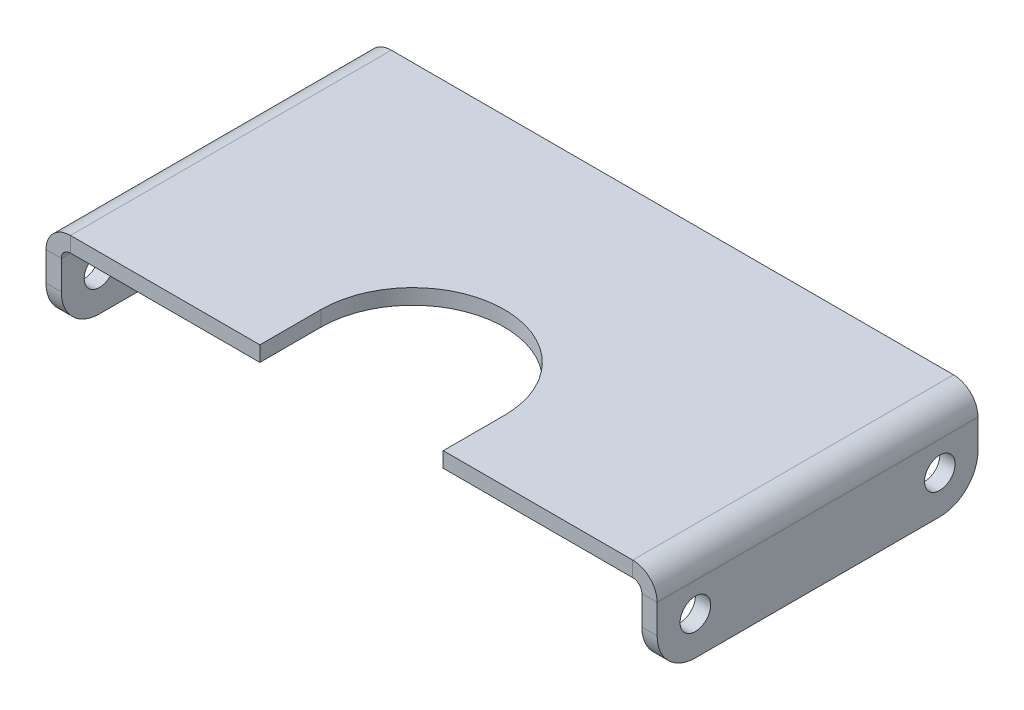
ISO-10303-21;
HEADER;
FILE_DESCRIPTION(('STEP AP214'),'2;1');
FILE_NAME('part.step','',(''),(''),'','','');
FILE_SCHEMA(('AUTOMOTIVE_DESIGN { 1 0 10303 214 1 1 1 1 }'));
ENDSEC;
DATA;
#1=APPLICATION_CONTEXT('core data for automotive mechanical design processes');
#2=APPLICATION_PROTOCOL_DEFINITION('international standard','automotive_design',2000,#1);
#3=PRODUCT_CONTEXT('',#1,'mechanical');
#4=PRODUCT('Part','Part','',(#3));
#5=PRODUCT_RELATED_PRODUCT_CATEGORY('part','',(#4));
#6=PRODUCT_DEFINITION_FORMATION('','',#4);
#7=PRODUCT_DEFINITION_CONTEXT('part definition',#1,'design');
#8=PRODUCT_DEFINITION('design','',#6,#7);
#9=PRODUCT_DEFINITION_SHAPE('','',#8);
#10=(LENGTH_UNIT() NAMED_UNIT(*) SI_UNIT(.MILLI.,.METRE.));
#11=(NAMED_UNIT(*) PLANE_ANGLE_UNIT() SI_UNIT($,.RADIAN.));
#12=(NAMED_UNIT(*) SI_UNIT($,.STERADIAN.) SOLID_ANGLE_UNIT());
#13=UNCERTAINTY_MEASURE_WITH_UNIT(LENGTH_MEASURE(1.E-05),#10,'distance_accuracy_value','');
#14=(GEOMETRIC_REPRESENTATION_CONTEXT(3) GLOBAL_UNCERTAINTY_ASSIGNED_CONTEXT((#13)) GLOBAL_UNIT_ASSIGNED_CONTEXT((#10,
#11,#12)) REPRESENTATION_CONTEXT('',''));
#15=CARTESIAN_POINT('',(0.,0.,0.));
#16=DIRECTION('',(0.,0.,1.));
#17=DIRECTION('',(1.,0.,0.));
#18=AXIS2_PLACEMENT_3D('',#15,#16,#17);
#19=CARTESIAN_POINT('',(-127.,0.,0.));
#20=DIRECTION('',(0.,0.,1.));
#21=DIRECTION('',(-1.,0.,0.));
#22=AXIS2_PLACEMENT_3D('',#19,#20,#21);
#23=PLANE('',#22);
#24=DIRECTION('',(0.,1.,0.));
#25=VECTOR('',#24,1.);
#26=CARTESIAN_POINT('',(116.84,0.,0.));
#27=LINE('',#26,#25);
#28=CARTESIAN_POINT('',(116.84,-6.34999999999997,0.));
#29=VERTEX_POINT('',#28);
#30=CARTESIAN_POINT('',(116.84,0.,0.));
#31=VERTEX_POINT('',#30);
#32=EDGE_CURVE('E11',#29,#31,#27,.T.);
#33=ORIENTED_EDGE('',*,*,#32,.F.);
#34=DIRECTION('',(1.,0.,0.));
#35=VECTOR('',#34,1.);
#36=CARTESIAN_POINT('',(-127.,-6.35,0.));
#37=LINE('',#36,#35);
#38=CARTESIAN_POINT('',(-116.84,-6.35,0.));
#39=VERTEX_POINT('',#38);
#40=EDGE_CURVE('E128',#29,#39,#37,.F.);
#41=ORIENTED_EDGE('',*,*,#40,.T.);
#42=DIRECTION('',(0.,1.,0.));
#43=VECTOR('',#42,1.);
#44=CARTESIAN_POINT('',(-116.84,0.,0.));
#45=LINE('',#44,#43);
#46=CARTESIAN_POINT('',(-116.84,0.,0.));
#47=VERTEX_POINT('',#46);
#48=EDGE_CURVE('E53',#39,#47,#45,.T.);
#49=ORIENTED_EDGE('',*,*,#48,.T.);
#50=DIRECTION('',(-1.,0.,0.));
#51=VECTOR('',#50,1.);
#52=CARTESIAN_POINT('',(-127.,0.,0.));
#53=LINE('',#52,#51);
#54=EDGE_CURVE('E131',#31,#47,#53,.T.);
#55=ORIENTED_EDGE('',*,*,#54,.F.);
#56=EDGE_LOOP('',(#33,#41,#49,#55));
#57=FACE_BOUND('',#56,.T.);
#58=ADVANCED_FACE('F43',(#57),#23,.F.);
#59=CARTESIAN_POINT('',(-116.84,-10.16,0.));
#60=DIRECTION('',(0.,0.,1.));
#61=DIRECTION('',(1.,0.,0.));
#62=AXIS2_PLACEMENT_3D('',#59,#60,#61);
#63=PLANE('',#62);
#64=ORIENTED_EDGE('',*,*,#48,.F.);
#65=CARTESIAN_POINT('',(-116.84,-10.16,0.));
#66=DIRECTION('',(0.,0.,-1.));
#67=DIRECTION('',(-1.,0.,0.));
#68=AXIS2_PLACEMENT_3D('',#65,#66,#67);
#69=CIRCLE('',#68,3.81);
#70=CARTESIAN_POINT('',(-120.65,-10.16,0.));
#71=VERTEX_POINT('',#70);
#72=EDGE_CURVE('E171',#39,#71,#69,.F.);
#73=ORIENTED_EDGE('',*,*,#72,.T.);
#74=DIRECTION('',(-1.,0.,0.));
#75=VECTOR('',#74,1.);
#76=CARTESIAN_POINT('',(-127.,-10.16,0.));
#77=LINE('',#76,#75);
#78=CARTESIAN_POINT('',(-127.,-10.16,0.));
#79=VERTEX_POINT('',#78);
#80=EDGE_CURVE('E227',#71,#79,#77,.T.);
#81=ORIENTED_EDGE('',*,*,#80,.T.);
#82=CARTESIAN_POINT('',(-116.84,-10.16,0.));
#83=DIRECTION('',(0.,0.,-1.));
#84=DIRECTION('',(-1.,0.,0.));
#85=AXIS2_PLACEMENT_3D('',#82,#83,#84);
#86=CIRCLE('',#85,10.16);
#87=EDGE_CURVE('E246',#47,#79,#86,.F.);
#88=ORIENTED_EDGE('',*,*,#87,.F.);
#89=EDGE_LOOP('',(#64,#73,#81,#88));
#90=FACE_BOUND('',#89,.T.);
#91=ADVANCED_FACE('F247',(#90),#63,.F.);
#92=CARTESIAN_POINT('',(-127.,0.,0.));
#93=DIRECTION('',(0.,0.,1.));
#94=DIRECTION('',(0.,-1.,0.));
#95=AXIS2_PLACEMENT_3D('',#92,#93,#94);
#96=PLANE('',#95);
#97=ORIENTED_EDGE('',*,*,#80,.F.);
#98=DIRECTION('',(0.,1.,0.));
#99=VECTOR('',#98,1.);
#100=CARTESIAN_POINT('',(-120.65,0.,0.));
#101=LINE('',#100,#99);
#102=CARTESIAN_POINT('',(-120.65,-22.225,0.));
#103=VERTEX_POINT('',#102);
#104=EDGE_CURVE('E303',#71,#103,#101,.F.);
#105=ORIENTED_EDGE('',*,*,#104,.T.);
#106=DIRECTION('',(-1.,0.,0.));
#107=VECTOR('',#106,1.);
#108=CARTESIAN_POINT('',(-127.,-22.225,0.));
#109=LINE('',#108,#107);
#110=CARTESIAN_POINT('',(-127.,-22.225,0.));
#111=VERTEX_POINT('',#110);
#112=EDGE_CURVE('E224',#103,#111,#109,.T.);
#113=ORIENTED_EDGE('',*,*,#112,.T.);
#114=DIRECTION('',(0.,-1.,0.));
#115=VECTOR('',#114,1.);
#116=CARTESIAN_POINT('',(-127.,0.,0.));
#117=LINE('',#116,#115);
#118=EDGE_CURVE('E325',#79,#111,#117,.T.);
#119=ORIENTED_EDGE('',*,*,#118,.F.);
#120=EDGE_LOOP('',(#97,#105,#113,#119));
#121=FACE_BOUND('',#120,.T.);
#122=ADVANCED_FACE('F322',(#121),#96,.F.);
#123=CARTESIAN_POINT('',(-127.,-22.225,15.875));
#124=DIRECTION('',(1.,0.,0.));
#125=DIRECTION('',(0.,0.,-1.));
#126=AXIS2_PLACEMENT_3D('',#123,#124,#125);
#127=CYLINDRICAL_SURFACE('',#126,15.875);
#128=ORIENTED_EDGE('',*,*,#112,.F.);
#129=CARTESIAN_POINT('',(-120.65,-22.225,15.875));
#130=DIRECTION('',(1.,0.,0.));
#131=DIRECTION('',(0.,0.,-1.));
#132=AXIS2_PLACEMENT_3D('',#129,#130,#131);
#133=CIRCLE('',#132,15.875);
#134=CARTESIAN_POINT('',(-120.65,-38.1,15.875));
#135=VERTEX_POINT('',#134);
#136=EDGE_CURVE('E296',#103,#135,#133,.F.);
#137=ORIENTED_EDGE('',*,*,#136,.T.);
#138=DIRECTION('',(-1.,0.,0.));
#139=VECTOR('',#138,1.);
#140=CARTESIAN_POINT('',(-127.,-38.1,15.875));
#141=LINE('',#140,#139);
#142=CARTESIAN_POINT('',(-127.,-38.1,15.875));
#143=VERTEX_POINT('',#142);
#144=EDGE_CURVE('E221',#135,#143,#141,.T.);
#145=ORIENTED_EDGE('',*,*,#144,.T.);
#146=CARTESIAN_POINT('',(-127.,-22.225,15.875));
#147=DIRECTION('',(1.,0.,0.));
#148=DIRECTION('',(0.,0.,-1.));
#149=AXIS2_PLACEMENT_3D('',#146,#147,#148);
#150=CIRCLE('',#149,15.875);
#151=EDGE_CURVE('E330',#111,#143,#150,.F.);
#152=ORIENTED_EDGE('',*,*,#151,.F.);
#153=EDGE_LOOP('',(#128,#137,#145,#152));
#154=FACE_BOUND('',#153,.T.);
#155=ADVANCED_FACE('F538',(#154),#127,.T.);
#156=CARTESIAN_POINT('',(-127.,-38.1,133.35));
#157=DIRECTION('',(0.,-1.,0.));
#158=DIRECTION('',(0.,0.,-1.));
#159=AXIS2_PLACEMENT_3D('',#156,#157,#158);
#160=PLANE('',#159);
#161=ORIENTED_EDGE('',*,*,#144,.F.);
#162=DIRECTION('',(0.,0.,-1.));
#163=VECTOR('',#162,1.);
#164=CARTESIAN_POINT('',(-120.65,-38.1,133.35));
#165=LINE('',#164,#163);
#166=CARTESIAN_POINT('',(-120.65,-38.1,117.475));
#167=VERTEX_POINT('',#166);
#168=EDGE_CURVE('E180',#167,#135,#165,.T.);
#169=ORIENTED_EDGE('',*,*,#168,.F.);
#170=DIRECTION('',(-1.,0.,0.));
#171=VECTOR('',#170,1.);
#172=CARTESIAN_POINT('',(-127.,-38.1,117.475));
#173=LINE('',#172,#171);
#174=CARTESIAN_POINT('',(-127.,-38.1,117.475));
#175=VERTEX_POINT('',#174);
#176=EDGE_CURVE('E218',#167,#175,#173,.T.);
#177=ORIENTED_EDGE('',*,*,#176,.T.);
#178=DIRECTION('',(0.,0.,-1.));
#179=VECTOR('',#178,1.);
#180=CARTESIAN_POINT('',(-127.,-38.1,133.35));
#181=LINE('',#180,#179);
#182=EDGE_CURVE('E373',#175,#143,#181,.T.);
#183=ORIENTED_EDGE('',*,*,#182,.T.);
#184=EDGE_LOOP('',(#161,#169,#177,#183));
#185=FACE_BOUND('',#184,.T.);
#186=ADVANCED_FACE('F372',(#185),#160,.T.);
#187=CARTESIAN_POINT('',(-127.,-22.225,117.475));
#188=DIRECTION('',(1.,0.,0.));
#189=DIRECTION('',(0.,0.,-1.));
#190=AXIS2_PLACEMENT_3D('',#187,#188,#189);
#191=CYLINDRICAL_SURFACE('',#190,15.875);
#192=ORIENTED_EDGE('',*,*,#176,.F.);
#193=CARTESIAN_POINT('',(-120.65,-22.225,117.475));
#194=DIRECTION('',(1.,0.,0.));
#195=DIRECTION('',(0.,0.,-1.));
#196=AXIS2_PLACEMENT_3D('',#193,#194,#195);
#197=CIRCLE('',#196,15.875);
#198=CARTESIAN_POINT('',(-120.65,-22.225,133.35));
#199=VERTEX_POINT('',#198);
#200=EDGE_CURVE('E304',#167,#199,#197,.F.);
#201=ORIENTED_EDGE('',*,*,#200,.T.);
#202=DIRECTION('',(-1.,0.,0.));
#203=VECTOR('',#202,1.);
#204=CARTESIAN_POINT('',(-127.,-22.225,133.35));
#205=LINE('',#204,#203);
#206=CARTESIAN_POINT('',(-127.,-22.225,133.35));
#207=VERTEX_POINT('',#206);
#208=EDGE_CURVE('E215',#199,#207,#205,.T.);
#209=ORIENTED_EDGE('',*,*,#208,.T.);
#210=CARTESIAN_POINT('',(-127.,-22.225,117.475));
#211=DIRECTION('',(1.,0.,0.));
#212=DIRECTION('',(0.,0.,-1.));
#213=AXIS2_PLACEMENT_3D('',#210,#211,#212);
#214=CIRCLE('',#213,15.875);
#215=EDGE_CURVE('E377',#175,#207,#214,.F.);
#216=ORIENTED_EDGE('',*,*,#215,.F.);
#217=EDGE_LOOP('',(#192,#201,#209,#216));
#218=FACE_BOUND('',#217,.T.);
#219=ADVANCED_FACE('F380',(#218),#191,.T.);
#220=CARTESIAN_POINT('',(-127.,0.,133.35));
#221=DIRECTION('',(0.,0.,1.));
#222=DIRECTION('',(0.,-1.,0.));
#223=AXIS2_PLACEMENT_3D('',#220,#221,#222);
#224=PLANE('',#223);
#225=ORIENTED_EDGE('',*,*,#208,.F.);
#226=DIRECTION('',(0.,1.,0.));
#227=VECTOR('',#226,1.);
#228=CARTESIAN_POINT('',(-120.65,0.,133.35));
#229=LINE('',#228,#227);
#230=CARTESIAN_POINT('',(-120.65,-10.16,133.35));
#231=VERTEX_POINT('',#230);
#232=EDGE_CURVE('E300',#231,#199,#229,.F.);
#233=ORIENTED_EDGE('',*,*,#232,.F.);
#234=DIRECTION('',(-1.,0.,0.));
#235=VECTOR('',#234,1.);
#236=CARTESIAN_POINT('',(-127.,-10.16,133.35));
#237=LINE('',#236,#235);
#238=CARTESIAN_POINT('',(-127.,-10.16,133.35));
#239=VERTEX_POINT('',#238);
#240=EDGE_CURVE('E212',#231,#239,#237,.T.);
#241=ORIENTED_EDGE('',*,*,#240,.T.);
#242=DIRECTION('',(0.,-1.,0.));
#243=VECTOR('',#242,1.);
#244=CARTESIAN_POINT('',(-127.,0.,133.35));
#245=LINE('',#244,#243);
#246=EDGE_CURVE('E331',#239,#207,#245,.T.);
#247=ORIENTED_EDGE('',*,*,#246,.T.);
#248=EDGE_LOOP('',(#225,#233,#241,#247));
#249=FACE_BOUND('',#248,.T.);
#250=ADVANCED_FACE('F531',(#249),#224,.T.);
#251=CARTESIAN_POINT('',(-116.84,-10.16,133.35));
#252=DIRECTION('',(0.,0.,-1.));
#253=DIRECTION('',(-1.,0.,0.));
#254=AXIS2_PLACEMENT_3D('',#251,#252,#253);
#255=PLANE('',#254);
#256=ORIENTED_EDGE('',*,*,#240,.F.);
#257=CARTESIAN_POINT('',(-116.84,-10.16,133.35));
#258=DIRECTION('',(0.,0.,-1.));
#259=DIRECTION('',(-1.,0.,0.));
#260=AXIS2_PLACEMENT_3D('',#257,#258,#259);
#261=CIRCLE('',#260,3.81);
#262=CARTESIAN_POINT('',(-116.84,-6.35,133.35));
#263=VERTEX_POINT('',#262);
#264=EDGE_CURVE('E167',#231,#263,#261,.T.);
#265=ORIENTED_EDGE('',*,*,#264,.T.);
#266=DIRECTION('',(0.,1.,0.));
#267=VECTOR('',#266,1.);
#268=CARTESIAN_POINT('',(-116.84,0.,133.35));
#269=LINE('',#268,#267);
#270=CARTESIAN_POINT('',(-116.84,0.,133.35));
#271=VERTEX_POINT('',#270);
#272=EDGE_CURVE('E61',#263,#271,#269,.T.);
#273=ORIENTED_EDGE('',*,*,#272,.T.);
#274=CARTESIAN_POINT('',(-116.84,-10.16,133.35));
#275=DIRECTION('',(0.,0.,1.));
#276=DIRECTION('',(1.,0.,0.));
#277=AXIS2_PLACEMENT_3D('',#274,#275,#276);
#278=CIRCLE('',#277,10.16);
#279=EDGE_CURVE('E251',#239,#271,#278,.F.);
#280=ORIENTED_EDGE('',*,*,#279,.F.);
#281=EDGE_LOOP('',(#256,#265,#273,#280));
#282=FACE_BOUND('',#281,.T.);
#283=ADVANCED_FACE('F528',(#282),#255,.F.);
#284=CARTESIAN_POINT('',(-127.,0.,133.35));
#285=DIRECTION('',(0.,0.,1.));
#286=DIRECTION('',(-1.,0.,0.));
#287=AXIS2_PLACEMENT_3D('',#284,#285,#286);
#288=PLANE('',#287);
#289=ORIENTED_EDGE('',*,*,#272,.F.);
#290=DIRECTION('',(1.,0.,0.));
#291=VECTOR('',#290,1.);
#292=CARTESIAN_POINT('',(-127.,-6.35,133.35));
#293=LINE('',#292,#291);
#294=CARTESIAN_POINT('',(-38.1,-6.34999999999999,133.35));
#295=VERTEX_POINT('',#294);
#296=EDGE_CURVE('E160',#295,#263,#293,.F.);
#297=ORIENTED_EDGE('',*,*,#296,.F.);
#298=DIRECTION('',(0.,1.,0.));
#299=VECTOR('',#298,1.);
#300=CARTESIAN_POINT('',(-38.1,0.,133.35));
#301=LINE('',#300,#299);
#302=CARTESIAN_POINT('',(-38.1,0.,133.35));
#303=VERTEX_POINT('',#302);
#304=EDGE_CURVE('E208',#295,#303,#301,.T.);
#305=ORIENTED_EDGE('',*,*,#304,.T.);
#306=DIRECTION('',(-1.,0.,0.));
#307=VECTOR('',#306,1.);
#308=CARTESIAN_POINT('',(-127.,0.,133.35));
#309=LINE('',#308,#307);
#310=EDGE_CURVE('E242',#303,#271,#309,.T.);
#311=ORIENTED_EDGE('',*,*,#310,.T.);
#312=EDGE_LOOP('',(#289,#297,#305,#311));
#313=FACE_BOUND('',#312,.T.);
#314=ADVANCED_FACE('F516',(#313),#288,.T.);
#315=CARTESIAN_POINT('',(-38.1,0.,107.95));
#316=DIRECTION('',(1.,0.,0.));
#317=DIRECTION('',(0.,0.,1.));
#318=AXIS2_PLACEMENT_3D('',#315,#316,#317);
#319=PLANE('',#318);
#320=ORIENTED_EDGE('',*,*,#304,.F.);
#321=DIRECTION('',(0.,0.,1.));
#322=VECTOR('',#321,1.);
#323=CARTESIAN_POINT('',(-38.1,-6.34999999999999,133.35));
#324=LINE('',#323,#322);
#325=CARTESIAN_POINT('',(-38.1,-6.34999999999999,107.95));
#326=VERTEX_POINT('',#325);
#327=EDGE_CURVE('E273',#326,#295,#324,.T.);
#328=ORIENTED_EDGE('',*,*,#327,.F.);
#329=DIRECTION('',(0.,1.,0.));
#330=VECTOR('',#329,1.);
#331=CARTESIAN_POINT('',(-38.1,0.,107.95));
#332=LINE('',#331,#330);
#333=CARTESIAN_POINT('',(-38.1,0.,107.95));
#334=VERTEX_POINT('',#333);
#335=EDGE_CURVE('E205',#326,#334,#332,.T.);
#336=ORIENTED_EDGE('',*,*,#335,.T.);
#337=DIRECTION('',(0.,0.,1.));
#338=VECTOR('',#337,1.);
#339=CARTESIAN_POINT('',(-38.1,0.,107.95));
#340=LINE('',#339,#338);
#341=EDGE_CURVE('E394',#334,#303,#340,.T.);
#342=ORIENTED_EDGE('',*,*,#341,.T.);
#343=EDGE_LOOP('',(#320,#328,#336,#342));
#344=FACE_BOUND('',#343,.T.);
#345=ADVANCED_FACE('F523',(#344),#319,.T.);
#346=CARTESIAN_POINT('',(0.,0.,107.95));
#347=DIRECTION('',(0.,-1.,0.));
#348=DIRECTION('',(1.,0.,0.));
#349=AXIS2_PLACEMENT_3D('',#346,#347,#348);
#350=CYLINDRICAL_SURFACE('',#349,38.1);
#351=ORIENTED_EDGE('',*,*,#335,.F.);
#352=CARTESIAN_POINT('',(0.,-6.35,107.95));
#353=DIRECTION('',(0.,1.,0.));
#354=DIRECTION('',(-1.,0.,0.));
#355=AXIS2_PLACEMENT_3D('',#352,#353,#354);
#356=CIRCLE('',#355,38.1);
#357=CARTESIAN_POINT('',(38.1,-6.34999999999998,107.95));
#358=VERTEX_POINT('',#357);
#359=EDGE_CURVE('E293',#358,#326,#356,.T.);
#360=ORIENTED_EDGE('',*,*,#359,.F.);
#361=DIRECTION('',(0.,1.,0.));
#362=VECTOR('',#361,1.);
#363=CARTESIAN_POINT('',(38.1,0.,107.95));
#364=LINE('',#363,#362);
#365=CARTESIAN_POINT('',(38.1,0.,107.95));
#366=VERTEX_POINT('',#365);
#367=EDGE_CURVE('E202',#358,#366,#364,.T.);
#368=ORIENTED_EDGE('',*,*,#367,.T.);
#369=CARTESIAN_POINT('',(0.,0.,107.95));
#370=DIRECTION('',(0.,1.,0.));
#371=DIRECTION('',(-1.,0.,0.));
#372=AXIS2_PLACEMENT_3D('',#369,#370,#371);
#373=CIRCLE('',#372,38.1);
#374=EDGE_CURVE('E386',#366,#334,#373,.T.);
#375=ORIENTED_EDGE('',*,*,#374,.T.);
#376=EDGE_LOOP('',(#351,#360,#368,#375));
#377=FACE_BOUND('',#376,.T.);
#378=ADVANCED_FACE('F519',(#377),#350,.F.);
#379=CARTESIAN_POINT('',(38.1,0.,107.95));
#380=DIRECTION('',(-1.,0.,0.));
#381=DIRECTION('',(0.,0.,-1.));
#382=AXIS2_PLACEMENT_3D('',#379,#380,#381);
#383=PLANE('',#382);
#384=ORIENTED_EDGE('',*,*,#367,.F.);
#385=DIRECTION('',(0.,0.,1.));
#386=VECTOR('',#385,1.);
#387=CARTESIAN_POINT('',(38.1,-6.34999999999998,133.35));
#388=LINE('',#387,#386);
#389=CARTESIAN_POINT('',(38.1,-6.34999999999998,133.35));
#390=VERTEX_POINT('',#389);
#391=EDGE_CURVE('E290',#390,#358,#388,.F.);
#392=ORIENTED_EDGE('',*,*,#391,.F.);
#393=DIRECTION('',(0.,1.,0.));
#394=VECTOR('',#393,1.);
#395=CARTESIAN_POINT('',(38.1,0.,133.35));
#396=LINE('',#395,#394);
#397=CARTESIAN_POINT('',(38.1,0.,133.35));
#398=VERTEX_POINT('',#397);
#399=EDGE_CURVE('E199',#390,#398,#396,.T.);
#400=ORIENTED_EDGE('',*,*,#399,.T.);
#401=DIRECTION('',(0.,0.,-1.));
#402=VECTOR('',#401,1.);
#403=CARTESIAN_POINT('',(38.1,0.,107.95));
#404=LINE('',#403,#402);
#405=EDGE_CURVE('E389',#398,#366,#404,.T.);
#406=ORIENTED_EDGE('',*,*,#405,.T.);
#407=EDGE_LOOP('',(#384,#392,#400,#406));
#408=FACE_BOUND('',#407,.T.);
#409=ADVANCED_FACE('F514',(#408),#383,.T.);
#410=ORIENTED_EDGE('',*,*,#399,.F.);
#411=DIRECTION('',(1.,0.,0.));
#412=VECTOR('',#411,1.);
#413=CARTESIAN_POINT('',(-127.,-6.35,133.35));
#414=LINE('',#413,#412);
#415=CARTESIAN_POINT('',(116.84,-6.34999999999997,133.35));
#416=VERTEX_POINT('',#415);
#417=EDGE_CURVE('E161',#416,#390,#414,.F.);
#418=ORIENTED_EDGE('',*,*,#417,.F.);
#419=DIRECTION('',(0.,1.,0.));
#420=VECTOR('',#419,1.);
#421=CARTESIAN_POINT('',(116.84,0.,133.35));
#422=LINE('',#421,#420);
#423=CARTESIAN_POINT('',(116.84,0.,133.35));
#424=VERTEX_POINT('',#423);
#425=EDGE_CURVE('E196',#416,#424,#422,.T.);
#426=ORIENTED_EDGE('',*,*,#425,.T.);
#427=EDGE_CURVE('E243',#424,#398,#309,.T.);
#428=ORIENTED_EDGE('',*,*,#427,.T.);
#429=EDGE_LOOP('',(#410,#418,#426,#428));
#430=FACE_BOUND('',#429,.T.);
#431=ADVANCED_FACE('F510',(#430),#288,.T.);
#432=CARTESIAN_POINT('',(116.84,-10.16,133.35));
#433=DIRECTION('',(0.,0.,-1.));
#434=DIRECTION('',(-1.,0.,0.));
#435=AXIS2_PLACEMENT_3D('',#432,#433,#434);
#436=PLANE('',#435);
#437=ORIENTED_EDGE('',*,*,#425,.F.);
#438=CARTESIAN_POINT('',(116.84,-10.16,133.35));
#439=DIRECTION('',(0.,0.,-1.));
#440=DIRECTION('',(-1.,0.,0.));
#441=AXIS2_PLACEMENT_3D('',#438,#439,#440);
#442=CIRCLE('',#441,3.81);
#443=CARTESIAN_POINT('',(120.65,-10.16,133.35));
#444=VERTEX_POINT('',#443);
#445=EDGE_CURVE('E147',#416,#444,#442,.T.);
#446=ORIENTED_EDGE('',*,*,#445,.T.);
#447=DIRECTION('',(1.,0.,0.));
#448=VECTOR('',#447,1.);
#449=CARTESIAN_POINT('',(127.,-10.16,133.35));
#450=LINE('',#449,#448);
#451=CARTESIAN_POINT('',(127.,-10.16,133.35));
#452=VERTEX_POINT('',#451);
#453=EDGE_CURVE('E193',#444,#452,#450,.T.);
#454=ORIENTED_EDGE('',*,*,#453,.T.);
#455=CARTESIAN_POINT('',(116.84,-10.16,133.35));
#456=DIRECTION('',(0.,0.,1.));
#457=DIRECTION('',(1.,0.,0.));
#458=AXIS2_PLACEMENT_3D('',#455,#456,#457);
#459=CIRCLE('',#458,10.16);
#460=EDGE_CURVE('E421',#424,#452,#459,.F.);
#461=ORIENTED_EDGE('',*,*,#460,.F.);
#462=EDGE_LOOP('',(#437,#446,#454,#461));
#463=FACE_BOUND('',#462,.T.);
#464=ADVANCED_FACE('F506',(#463),#436,.F.);
#465=CARTESIAN_POINT('',(127.,0.,133.35));
#466=DIRECTION('',(0.,0.,1.));
#467=DIRECTION('',(0.,1.,0.));
#468=AXIS2_PLACEMENT_3D('',#465,#466,#467);
#469=PLANE('',#468);
#470=ORIENTED_EDGE('',*,*,#453,.F.);
#471=DIRECTION('',(0.,1.,0.));
#472=VECTOR('',#471,1.);
#473=CARTESIAN_POINT('',(120.65,0.,133.35));
#474=LINE('',#473,#472);
#475=CARTESIAN_POINT('',(120.65,-22.225,133.35));
#476=VERTEX_POINT('',#475);
#477=EDGE_CURVE('E276',#476,#444,#474,.T.);
#478=ORIENTED_EDGE('',*,*,#477,.F.);
#479=DIRECTION('',(1.,0.,0.));
#480=VECTOR('',#479,1.);
#481=CARTESIAN_POINT('',(127.,-22.225,133.35));
#482=LINE('',#481,#480);
#483=CARTESIAN_POINT('',(127.,-22.225,133.35));
#484=VERTEX_POINT('',#483);
#485=EDGE_CURVE('E190',#476,#484,#482,.T.);
#486=ORIENTED_EDGE('',*,*,#485,.T.);
#487=DIRECTION('',(0.,1.,0.));
#488=VECTOR('',#487,1.);
#489=CARTESIAN_POINT('',(127.,0.,133.35));
#490=LINE('',#489,#488);
#491=EDGE_CURVE('E403',#484,#452,#490,.T.);
#492=ORIENTED_EDGE('',*,*,#491,.T.);
#493=EDGE_LOOP('',(#470,#478,#486,#492));
#494=FACE_BOUND('',#493,.T.);
#495=ADVANCED_FACE('F502',(#494),#469,.T.);
#496=CARTESIAN_POINT('',(127.,-22.225,117.475));
#497=DIRECTION('',(-1.,0.,0.));
#498=DIRECTION('',(0.,0.,1.));
#499=AXIS2_PLACEMENT_3D('',#496,#497,#498);
#500=CYLINDRICAL_SURFACE('',#499,15.875);
#501=ORIENTED_EDGE('',*,*,#485,.F.);
#502=CARTESIAN_POINT('',(120.65,-22.225,117.475));
#503=DIRECTION('',(-1.,0.,0.));
#504=DIRECTION('',(0.,0.,1.));
#505=AXIS2_PLACEMENT_3D('',#502,#503,#504);
#506=CIRCLE('',#505,15.875);
#507=CARTESIAN_POINT('',(120.65,-38.1,117.475));
#508=VERTEX_POINT('',#507);
#509=EDGE_CURVE('E284',#476,#508,#506,.F.);
#510=ORIENTED_EDGE('',*,*,#509,.T.);
#511=DIRECTION('',(1.,0.,0.));
#512=VECTOR('',#511,1.);
#513=CARTESIAN_POINT('',(127.,-38.1,117.475));
#514=LINE('',#513,#512);
#515=CARTESIAN_POINT('',(127.,-38.1,117.475));
#516=VERTEX_POINT('',#515);
#517=EDGE_CURVE('E187',#508,#516,#514,.T.);
#518=ORIENTED_EDGE('',*,*,#517,.T.);
#519=CARTESIAN_POINT('',(127.,-22.225,117.475));
#520=DIRECTION('',(-1.,0.,0.));
#521=DIRECTION('',(0.,0.,1.));
#522=AXIS2_PLACEMENT_3D('',#519,#520,#521);
#523=CIRCLE('',#522,15.875);
#524=EDGE_CURVE('E406',#484,#516,#523,.F.);
#525=ORIENTED_EDGE('',*,*,#524,.F.);
#526=EDGE_LOOP('',(#501,#510,#518,#525));
#527=FACE_BOUND('',#526,.T.);
#528=ADVANCED_FACE('F498',(#527),#500,.T.);
#529=CARTESIAN_POINT('',(127.,-38.1,133.35));
#530=DIRECTION('',(0.,1.,0.));
#531=DIRECTION('',(0.,0.,-1.));
#532=AXIS2_PLACEMENT_3D('',#529,#530,#531);
#533=PLANE('',#532);
#534=ORIENTED_EDGE('',*,*,#517,.F.);
#535=DIRECTION('',(0.,0.,1.));
#536=VECTOR('',#535,1.);
#537=CARTESIAN_POINT('',(120.65,-38.1,133.35));
#538=LINE('',#537,#536);
#539=CARTESIAN_POINT('',(120.65,-38.1,15.875));
#540=VERTEX_POINT('',#539);
#541=EDGE_CURVE('E281',#508,#540,#538,.F.);
#542=ORIENTED_EDGE('',*,*,#541,.T.);
#543=DIRECTION('',(1.,0.,0.));
#544=VECTOR('',#543,1.);
#545=CARTESIAN_POINT('',(127.,-38.1,15.875));
#546=LINE('',#545,#544);
#547=CARTESIAN_POINT('',(127.,-38.1,15.875));
#548=VERTEX_POINT('',#547);
#549=EDGE_CURVE('E184',#540,#548,#546,.T.);
#550=ORIENTED_EDGE('',*,*,#549,.T.);
#551=DIRECTION('',(0.,0.,-1.));
#552=VECTOR('',#551,1.);
#553=CARTESIAN_POINT('',(127.,-38.1,133.35));
#554=LINE('',#553,#552);
#555=EDGE_CURVE('E409',#516,#548,#554,.T.);
#556=ORIENTED_EDGE('',*,*,#555,.F.);
#557=EDGE_LOOP('',(#534,#542,#550,#556));
#558=FACE_BOUND('',#557,.T.);
#559=ADVANCED_FACE('F494',(#558),#533,.F.);
#560=CARTESIAN_POINT('',(127.,-22.225,15.875));
#561=DIRECTION('',(-1.,0.,0.));
#562=DIRECTION('',(0.,0.,1.));
#563=AXIS2_PLACEMENT_3D('',#560,#561,#562);
#564=CYLINDRICAL_SURFACE('',#563,15.875);
#565=ORIENTED_EDGE('',*,*,#549,.F.);
#566=CARTESIAN_POINT('',(120.65,-22.225,15.875));
#567=DIRECTION('',(-1.,0.,0.));
#568=DIRECTION('',(0.,0.,1.));
#569=AXIS2_PLACEMENT_3D('',#566,#567,#568);
#570=CIRCLE('',#569,15.875);
#571=CARTESIAN_POINT('',(120.65,-22.225,0.));
#572=VERTEX_POINT('',#571);
#573=EDGE_CURVE('E278',#540,#572,#570,.F.);
#574=ORIENTED_EDGE('',*,*,#573,.T.);
#575=DIRECTION('',(1.,0.,0.));
#576=VECTOR('',#575,1.);
#577=CARTESIAN_POINT('',(127.,-22.225,0.));
#578=LINE('',#577,#576);
#579=CARTESIAN_POINT('',(127.,-22.225,0.));
#580=VERTEX_POINT('',#579);
#581=EDGE_CURVE('E181',#572,#580,#578,.T.);
#582=ORIENTED_EDGE('',*,*,#581,.T.);
#583=CARTESIAN_POINT('',(127.,-22.225,15.875));
#584=DIRECTION('',(-1.,0.,0.));
#585=DIRECTION('',(0.,0.,1.));
#586=AXIS2_PLACEMENT_3D('',#583,#584,#585);
#587=CIRCLE('',#586,15.875);
#588=EDGE_CURVE('E412',#548,#580,#587,.F.);
#589=ORIENTED_EDGE('',*,*,#588,.F.);
#590=EDGE_LOOP('',(#565,#574,#582,#589));
#591=FACE_BOUND('',#590,.T.);
#592=ADVANCED_FACE('F465',(#591),#564,.T.);
#593=CARTESIAN_POINT('',(127.,0.,0.));
#594=DIRECTION('',(0.,0.,1.));
#595=DIRECTION('',(0.,1.,0.));
#596=AXIS2_PLACEMENT_3D('',#593,#594,#595);
#597=PLANE('',#596);
#598=ORIENTED_EDGE('',*,*,#581,.F.);
#599=DIRECTION('',(0.,1.,0.));
#600=VECTOR('',#599,1.);
#601=CARTESIAN_POINT('',(120.65,0.,0.));
#602=LINE('',#601,#600);
#603=CARTESIAN_POINT('',(120.65,-10.16,0.));
#604=VERTEX_POINT('',#603);
#605=EDGE_CURVE('E152',#572,#604,#602,.T.);
#606=ORIENTED_EDGE('',*,*,#605,.T.);
#607=DIRECTION('',(1.,0.,0.));
#608=VECTOR('',#607,1.);
#609=CARTESIAN_POINT('',(127.,-10.16,0.));
#610=LINE('',#609,#608);
#611=CARTESIAN_POINT('',(127.,-10.16,0.));
#612=VERTEX_POINT('',#611);
#613=EDGE_CURVE('E47',#604,#612,#610,.T.);
#614=ORIENTED_EDGE('',*,*,#613,.T.);
#615=DIRECTION('',(0.,1.,0.));
#616=VECTOR('',#615,1.);
#617=CARTESIAN_POINT('',(127.,0.,0.));
#618=LINE('',#617,#616);
#619=EDGE_CURVE('E415',#580,#612,#618,.T.);
#620=ORIENTED_EDGE('',*,*,#619,.F.);
#621=EDGE_LOOP('',(#598,#606,#614,#620));
#622=FACE_BOUND('',#621,.T.);
#623=ADVANCED_FACE('F459',(#622),#597,.F.);
#624=CARTESIAN_POINT('',(-127.,-22.225,15.875));
#625=DIRECTION('',(1.,0.,0.));
#626=DIRECTION('',(0.,0.,-1.));
#627=AXIS2_PLACEMENT_3D('',#624,#625,#626);
#628=CYLINDRICAL_SURFACE('',#627,6.35);
#629=CARTESIAN_POINT('',(-127.,-22.225,15.875));
#630=DIRECTION('',(-1.,0.,0.));
#631=DIRECTION('',(0.,0.,1.));
#632=AXIS2_PLACEMENT_3D('',#629,#630,#631);
#633=CIRCLE('',#632,6.35);
#634=CARTESIAN_POINT('',(-127.,-22.225,22.225));
#635=VERTEX_POINT('',#634);
#636=EDGE_CURVE('E423',#635,#635,#633,.T.);
#637=ORIENTED_EDGE('',*,*,#636,.T.);
#638=EDGE_LOOP('',(#637));
#639=FACE_BOUND('',#638,.T.);
#640=CARTESIAN_POINT('',(-120.65,-22.225,15.875));
#641=DIRECTION('',(-1.,0.,0.));
#642=DIRECTION('',(0.,0.,1.));
#643=AXIS2_PLACEMENT_3D('',#640,#641,#642);
#644=CIRCLE('',#643,6.35);
#645=CARTESIAN_POINT('',(-120.65,-22.225,22.225));
#646=VERTEX_POINT('',#645);
#647=EDGE_CURVE('E169',#646,#646,#644,.T.);
#648=ORIENTED_EDGE('',*,*,#647,.F.);
#649=EDGE_LOOP('',(#648));
#650=FACE_BOUND('',#649,.T.);
#651=ADVANCED_FACE('F457',(#639,#650),#628,.F.);
#652=CARTESIAN_POINT('',(-127.,-22.225,117.475));
#653=DIRECTION('',(1.,0.,0.));
#654=DIRECTION('',(0.,0.,-1.));
#655=AXIS2_PLACEMENT_3D('',#652,#653,#654);
#656=CYLINDRICAL_SURFACE('',#655,6.35);
#657=CARTESIAN_POINT('',(-127.,-22.225,117.475));
#658=DIRECTION('',(-1.,0.,0.));
#659=DIRECTION('',(0.,0.,-1.));
#660=AXIS2_PLACEMENT_3D('',#657,#658,#659);
#661=CIRCLE('',#660,6.35);
#662=CARTESIAN_POINT('',(-127.,-22.225,111.125));
#663=VERTEX_POINT('',#662);
#664=EDGE_CURVE('E378',#663,#663,#661,.T.);
#665=ORIENTED_EDGE('',*,*,#664,.T.);
#666=EDGE_LOOP('',(#665));
#667=FACE_BOUND('',#666,.T.);
#668=CARTESIAN_POINT('',(-120.65,-22.225,117.475));
#669=DIRECTION('',(-1.,0.,0.));
#670=DIRECTION('',(0.,0.,1.));
#671=AXIS2_PLACEMENT_3D('',#668,#669,#670);
#672=CIRCLE('',#671,6.35);
#673=CARTESIAN_POINT('',(-120.65,-22.225,123.825));
#674=VERTEX_POINT('',#673);
#675=EDGE_CURVE('E177',#674,#674,#672,.T.);
#676=ORIENTED_EDGE('',*,*,#675,.F.);
#677=EDGE_LOOP('',(#676));
#678=FACE_BOUND('',#677,.T.);
#679=ADVANCED_FACE('F45',(#667,#678),#656,.F.);
#680=CARTESIAN_POINT('',(127.,-22.225,15.875));
#681=DIRECTION('',(-1.,0.,0.));
#682=DIRECTION('',(0.,0.,1.));
#683=AXIS2_PLACEMENT_3D('',#680,#681,#682);
#684=CYLINDRICAL_SURFACE('',#683,6.35);
#685=CARTESIAN_POINT('',(127.,-22.225,15.875));
#686=DIRECTION('',(-1.,0.,0.));
#687=DIRECTION('',(0.,0.,1.));
#688=AXIS2_PLACEMENT_3D('',#685,#686,#687);
#689=CIRCLE('',#688,6.35);
#690=CARTESIAN_POINT('',(127.,-22.225,22.225));
#691=VERTEX_POINT('',#690);
#692=EDGE_CURVE('E397',#691,#691,#689,.T.);
#693=ORIENTED_EDGE('',*,*,#692,.F.);
#694=EDGE_LOOP('',(#693));
#695=FACE_BOUND('',#694,.T.);
#696=CARTESIAN_POINT('',(120.65,-22.225,15.875));
#697=DIRECTION('',(-1.,0.,0.));
#698=DIRECTION('',(0.,0.,1.));
#699=AXIS2_PLACEMENT_3D('',#696,#697,#698);
#700=CIRCLE('',#699,6.35);
#701=CARTESIAN_POINT('',(120.65,-22.225,22.225));
#702=VERTEX_POINT('',#701);
#703=EDGE_CURVE('E269',#702,#702,#700,.T.);
#704=ORIENTED_EDGE('',*,*,#703,.T.);
#705=EDGE_LOOP('',(#704));
#706=FACE_BOUND('',#705,.T.);
#707=ADVANCED_FACE('F464',(#695,#706),#684,.F.);
#708=CARTESIAN_POINT('',(127.,-22.225,117.475));
#709=DIRECTION('',(-1.,0.,0.));
#710=DIRECTION('',(0.,0.,1.));
#711=AXIS2_PLACEMENT_3D('',#708,#709,#710);
#712=CYLINDRICAL_SURFACE('',#711,6.35);
#713=CARTESIAN_POINT('',(127.,-22.225,117.475));
#714=DIRECTION('',(-1.,0.,0.));
#715=DIRECTION('',(0.,0.,-1.));
#716=AXIS2_PLACEMENT_3D('',#713,#714,#715);
#717=CIRCLE('',#716,6.35);
#718=CARTESIAN_POINT('',(127.,-22.225,111.125));
#719=VERTEX_POINT('',#718);
#720=EDGE_CURVE('E400',#719,#719,#717,.T.);
#721=ORIENTED_EDGE('',*,*,#720,.F.);
#722=EDGE_LOOP('',(#721));
#723=FACE_BOUND('',#722,.T.);
#724=CARTESIAN_POINT('',(120.65,-22.225,117.475));
#725=DIRECTION('',(-1.,0.,0.));
#726=DIRECTION('',(0.,0.,1.));
#727=AXIS2_PLACEMENT_3D('',#724,#725,#726);
#728=CIRCLE('',#727,6.35);
#729=CARTESIAN_POINT('',(120.65,-22.225,123.825));
#730=VERTEX_POINT('',#729);
#731=EDGE_CURVE('E272',#730,#730,#728,.T.);
#732=ORIENTED_EDGE('',*,*,#731,.T.);
#733=EDGE_LOOP('',(#732));
#734=FACE_BOUND('',#733,.T.);
#735=ADVANCED_FACE('F456',(#723,#734),#712,.F.);
#736=CARTESIAN_POINT('',(116.84,-10.16,0.));
#737=DIRECTION('',(0.,0.,1.));
#738=DIRECTION('',(1.,0.,0.));
#739=AXIS2_PLACEMENT_3D('',#736,#737,#738);
#740=PLANE('',#739);
#741=CARTESIAN_POINT('',(116.84,-10.16,0.));
#742=DIRECTION('',(0.,0.,-1.));
#743=DIRECTION('',(-1.,0.,0.));
#744=AXIS2_PLACEMENT_3D('',#741,#742,#743);
#745=CIRCLE('',#744,3.81);
#746=EDGE_CURVE('E144',#604,#29,#745,.F.);
#747=ORIENTED_EDGE('',*,*,#746,.T.);
#748=ORIENTED_EDGE('',*,*,#32,.T.);
#749=CARTESIAN_POINT('',(116.84,-10.16,0.));
#750=DIRECTION('',(0.,0.,-1.));
#751=DIRECTION('',(-1.,0.,0.));
#752=AXIS2_PLACEMENT_3D('',#749,#750,#751);
#753=CIRCLE('',#752,10.16);
#754=EDGE_CURVE('E263',#612,#31,#753,.F.);
#755=ORIENTED_EDGE('',*,*,#754,.F.);
#756=ORIENTED_EDGE('',*,*,#613,.F.);
#757=EDGE_LOOP('',(#747,#748,#755,#756));
#758=FACE_BOUND('',#757,.T.);
#759=ADVANCED_FACE('F164',(#758),#740,.F.);
#760=CARTESIAN_POINT('',(127.,0.,133.35));
#761=DIRECTION('',(-1.,0.,0.));
#762=DIRECTION('',(0.,0.,1.));
#763=AXIS2_PLACEMENT_3D('',#760,#761,#762);
#764=PLANE('',#763);
#765=ORIENTED_EDGE('',*,*,#692,.T.);
#766=EDGE_LOOP('',(#765));
#767=FACE_BOUND('',#766,.T.);
#768=ORIENTED_EDGE('',*,*,#720,.T.);
#769=EDGE_LOOP('',(#768));
#770=FACE_BOUND('',#769,.T.);
#771=ORIENTED_EDGE('',*,*,#619,.T.);
#772=DIRECTION('',(0.,0.,-1.));
#773=VECTOR('',#772,1.);
#774=CARTESIAN_POINT('',(127.,-10.16,133.35));
#775=LINE('',#774,#773);
#776=EDGE_CURVE('E258',#612,#452,#775,.F.);
#777=ORIENTED_EDGE('',*,*,#776,.T.);
#778=ORIENTED_EDGE('',*,*,#491,.F.);
#779=ORIENTED_EDGE('',*,*,#524,.T.);
#780=ORIENTED_EDGE('',*,*,#555,.T.);
#781=ORIENTED_EDGE('',*,*,#588,.T.);
#782=EDGE_LOOP('',(#771,#777,#778,#779,#780,#781));
#783=FACE_BOUND('',#782,.T.);
#784=ADVANCED_FACE('F445',(#767,#770,#783),#764,.F.);
#785=CARTESIAN_POINT('',(-127.,0.,133.35));
#786=DIRECTION('',(0.,-1.,0.));
#787=DIRECTION('',(1.,0.,0.));
#788=AXIS2_PLACEMENT_3D('',#785,#786,#787);
#789=PLANE('',#788);
#790=ORIENTED_EDGE('',*,*,#54,.T.);
#791=DIRECTION('',(0.,0.,-1.));
#792=VECTOR('',#791,1.);
#793=CARTESIAN_POINT('',(-116.84,0.,133.35));
#794=LINE('',#793,#792);
#795=EDGE_CURVE('E238',#47,#271,#794,.F.);
#796=ORIENTED_EDGE('',*,*,#795,.T.);
#797=ORIENTED_EDGE('',*,*,#310,.F.);
#798=ORIENTED_EDGE('',*,*,#341,.F.);
#799=ORIENTED_EDGE('',*,*,#374,.F.);
#800=ORIENTED_EDGE('',*,*,#405,.F.);
#801=ORIENTED_EDGE('',*,*,#427,.F.);
#802=DIRECTION('',(0.,0.,-1.));
#803=VECTOR('',#802,1.);
#804=CARTESIAN_POINT('',(116.84,0.,133.35));
#805=LINE('',#804,#803);
#806=EDGE_CURVE('E241',#424,#31,#805,.T.);
#807=ORIENTED_EDGE('',*,*,#806,.T.);
#808=EDGE_LOOP('',(#790,#796,#797,#798,#799,#800,#801,#807));
#809=FACE_BOUND('',#808,.T.);
#810=ADVANCED_FACE('F235',(#809),#789,.F.);
#811=CARTESIAN_POINT('',(-127.,0.,133.35));
#812=DIRECTION('',(1.,0.,0.));
#813=DIRECTION('',(0.,0.,-1.));
#814=AXIS2_PLACEMENT_3D('',#811,#812,#813);
#815=PLANE('',#814);
#816=ORIENTED_EDGE('',*,*,#636,.F.);
#817=EDGE_LOOP('',(#816));
#818=FACE_BOUND('',#817,.T.);
#819=ORIENTED_EDGE('',*,*,#664,.F.);
#820=EDGE_LOOP('',(#819));
#821=FACE_BOUND('',#820,.T.);
#822=ORIENTED_EDGE('',*,*,#246,.F.);
#823=DIRECTION('',(0.,0.,-1.));
#824=VECTOR('',#823,1.);
#825=CARTESIAN_POINT('',(-127.,-10.16,133.35));
#826=LINE('',#825,#824);
#827=EDGE_CURVE('E255',#239,#79,#826,.T.);
#828=ORIENTED_EDGE('',*,*,#827,.T.);
#829=ORIENTED_EDGE('',*,*,#118,.T.);
#830=ORIENTED_EDGE('',*,*,#151,.T.);
#831=ORIENTED_EDGE('',*,*,#182,.F.);
#832=ORIENTED_EDGE('',*,*,#215,.T.);
#833=EDGE_LOOP('',(#822,#828,#829,#830,#831,#832));
#834=FACE_BOUND('',#833,.T.);
#835=ADVANCED_FACE('F334',(#818,#821,#834),#815,.F.);
#836=CARTESIAN_POINT('',(116.84,-10.16,133.35));
#837=DIRECTION('',(0.,0.,-1.));
#838=DIRECTION('',(-1.,0.,0.));
#839=AXIS2_PLACEMENT_3D('',#836,#837,#838);
#840=CYLINDRICAL_SURFACE('',#839,10.16);
#841=ORIENTED_EDGE('',*,*,#460,.T.);
#842=ORIENTED_EDGE('',*,*,#776,.F.);
#843=ORIENTED_EDGE('',*,*,#754,.T.);
#844=ORIENTED_EDGE('',*,*,#806,.F.);
#845=EDGE_LOOP('',(#841,#842,#843,#844));
#846=FACE_BOUND('',#845,.T.);
#847=ADVANCED_FACE('F437',(#846),#840,.T.);
#848=CARTESIAN_POINT('',(-116.84,-10.16,133.35));
#849=DIRECTION('',(0.,0.,-1.));
#850=DIRECTION('',(-1.,0.,0.));
#851=AXIS2_PLACEMENT_3D('',#848,#849,#850);
#852=CYLINDRICAL_SURFACE('',#851,10.16);
#853=ORIENTED_EDGE('',*,*,#279,.T.);
#854=ORIENTED_EDGE('',*,*,#795,.F.);
#855=ORIENTED_EDGE('',*,*,#87,.T.);
#856=ORIENTED_EDGE('',*,*,#827,.F.);
#857=EDGE_LOOP('',(#853,#854,#855,#856));
#858=FACE_BOUND('',#857,.T.);
#859=ADVANCED_FACE('F253',(#858),#852,.T.);
#860=CARTESIAN_POINT('',(120.65,0.,133.35));
#861=DIRECTION('',(-1.,0.,0.));
#862=DIRECTION('',(0.,0.,1.));
#863=AXIS2_PLACEMENT_3D('',#860,#861,#862);
#864=PLANE('',#863);
#865=ORIENTED_EDGE('',*,*,#703,.F.);
#866=EDGE_LOOP('',(#865));
#867=FACE_BOUND('',#866,.T.);
#868=ORIENTED_EDGE('',*,*,#731,.F.);
#869=EDGE_LOOP('',(#868));
#870=FACE_BOUND('',#869,.T.);
#871=ORIENTED_EDGE('',*,*,#605,.F.);
#872=ORIENTED_EDGE('',*,*,#573,.F.);
#873=ORIENTED_EDGE('',*,*,#541,.F.);
#874=ORIENTED_EDGE('',*,*,#509,.F.);
#875=ORIENTED_EDGE('',*,*,#477,.T.);
#876=DIRECTION('',(0.,0.,1.));
#877=VECTOR('',#876,1.);
#878=CARTESIAN_POINT('',(120.65,-10.16,133.35));
#879=LINE('',#878,#877);
#880=EDGE_CURVE('E151',#604,#444,#879,.T.);
#881=ORIENTED_EDGE('',*,*,#880,.F.);
#882=EDGE_LOOP('',(#871,#872,#873,#874,#875,#881));
#883=FACE_BOUND('',#882,.T.);
#884=ADVANCED_FACE('F480',(#867,#870,#883),#864,.T.);
#885=CARTESIAN_POINT('',(-127.,-6.35,133.35));
#886=DIRECTION('',(0.,-1.,0.));
#887=DIRECTION('',(1.,0.,0.));
#888=AXIS2_PLACEMENT_3D('',#885,#886,#887);
#889=PLANE('',#888);
#890=ORIENTED_EDGE('',*,*,#40,.F.);
#891=DIRECTION('',(0.,0.,1.));
#892=VECTOR('',#891,1.);
#893=CARTESIAN_POINT('',(116.84,-6.34999999999997,133.35));
#894=LINE('',#893,#892);
#895=EDGE_CURVE('E141',#416,#29,#894,.F.);
#896=ORIENTED_EDGE('',*,*,#895,.F.);
#897=ORIENTED_EDGE('',*,*,#417,.T.);
#898=ORIENTED_EDGE('',*,*,#391,.T.);
#899=ORIENTED_EDGE('',*,*,#359,.T.);
#900=ORIENTED_EDGE('',*,*,#327,.T.);
#901=ORIENTED_EDGE('',*,*,#296,.T.);
#902=DIRECTION('',(0.,0.,1.));
#903=VECTOR('',#902,1.);
#904=CARTESIAN_POINT('',(-116.84,-6.35,133.35));
#905=LINE('',#904,#903);
#906=EDGE_CURVE('E158',#39,#263,#905,.T.);
#907=ORIENTED_EDGE('',*,*,#906,.F.);
#908=EDGE_LOOP('',(#890,#896,#897,#898,#899,#900,#901,#907));
#909=FACE_BOUND('',#908,.T.);
#910=ADVANCED_FACE('F155',(#909),#889,.T.);
#911=CARTESIAN_POINT('',(-120.65,0.,133.35));
#912=DIRECTION('',(1.,0.,0.));
#913=DIRECTION('',(0.,0.,-1.));
#914=AXIS2_PLACEMENT_3D('',#911,#912,#913);
#915=PLANE('',#914);
#916=ORIENTED_EDGE('',*,*,#647,.T.);
#917=EDGE_LOOP('',(#916));
#918=FACE_BOUND('',#917,.T.);
#919=ORIENTED_EDGE('',*,*,#675,.T.);
#920=EDGE_LOOP('',(#919));
#921=FACE_BOUND('',#920,.T.);
#922=ORIENTED_EDGE('',*,*,#232,.T.);
#923=ORIENTED_EDGE('',*,*,#200,.F.);
#924=ORIENTED_EDGE('',*,*,#168,.T.);
#925=ORIENTED_EDGE('',*,*,#136,.F.);
#926=ORIENTED_EDGE('',*,*,#104,.F.);
#927=DIRECTION('',(0.,0.,-1.));
#928=VECTOR('',#927,1.);
#929=CARTESIAN_POINT('',(-120.65,-10.16,133.35));
#930=LINE('',#929,#928);
#931=EDGE_CURVE('E264',#231,#71,#930,.T.);
#932=ORIENTED_EDGE('',*,*,#931,.F.);
#933=EDGE_LOOP('',(#922,#923,#924,#925,#926,#932));
#934=FACE_BOUND('',#933,.T.);
#935=ADVANCED_FACE('F320',(#918,#921,#934),#915,.T.);
#936=CARTESIAN_POINT('',(116.84,-10.16,133.35));
#937=DIRECTION('',(0.,0.,-1.));
#938=DIRECTION('',(-1.,0.,0.));
#939=AXIS2_PLACEMENT_3D('',#936,#937,#938);
#940=CYLINDRICAL_SURFACE('',#939,3.81);
#941=ORIENTED_EDGE('',*,*,#445,.F.);
#942=ORIENTED_EDGE('',*,*,#895,.T.);
#943=ORIENTED_EDGE('',*,*,#746,.F.);
#944=ORIENTED_EDGE('',*,*,#880,.T.);
#945=EDGE_LOOP('',(#941,#942,#943,#944));
#946=FACE_BOUND('',#945,.T.);
#947=ADVANCED_FACE('F142',(#946),#940,.F.);
#948=CARTESIAN_POINT('',(-116.84,-10.16,133.35));
#949=DIRECTION('',(0.,0.,-1.));
#950=DIRECTION('',(-1.,0.,0.));
#951=AXIS2_PLACEMENT_3D('',#948,#949,#950);
#952=CYLINDRICAL_SURFACE('',#951,3.81);
#953=ORIENTED_EDGE('',*,*,#264,.F.);
#954=ORIENTED_EDGE('',*,*,#931,.T.);
#955=ORIENTED_EDGE('',*,*,#72,.F.);
#956=ORIENTED_EDGE('',*,*,#906,.T.);
#957=EDGE_LOOP('',(#953,#954,#955,#956));
#958=FACE_BOUND('',#957,.T.);
#959=ADVANCED_FACE('F314',(#958),#952,.F.);
#960=CLOSED_SHELL('',(#58,#91,#122,#155,#186,#219,#250,#283,#314,#345,#378,#409,#431,#464,#495,
#528,#559,#592,#623,#651,#679,#707,#735,#759,#784,#810,#835,#847,#859,#884,#910,#935,#947,#959));
#961=MANIFOLD_SOLID_BREP('B2',#960);
#962=ADVANCED_BREP_SHAPE_REPRESENTATION('',(#18,#961),#14);
#963=SHAPE_DEFINITION_REPRESENTATION(#9,#962);
ENDSEC;
END-ISO-10303-21;
